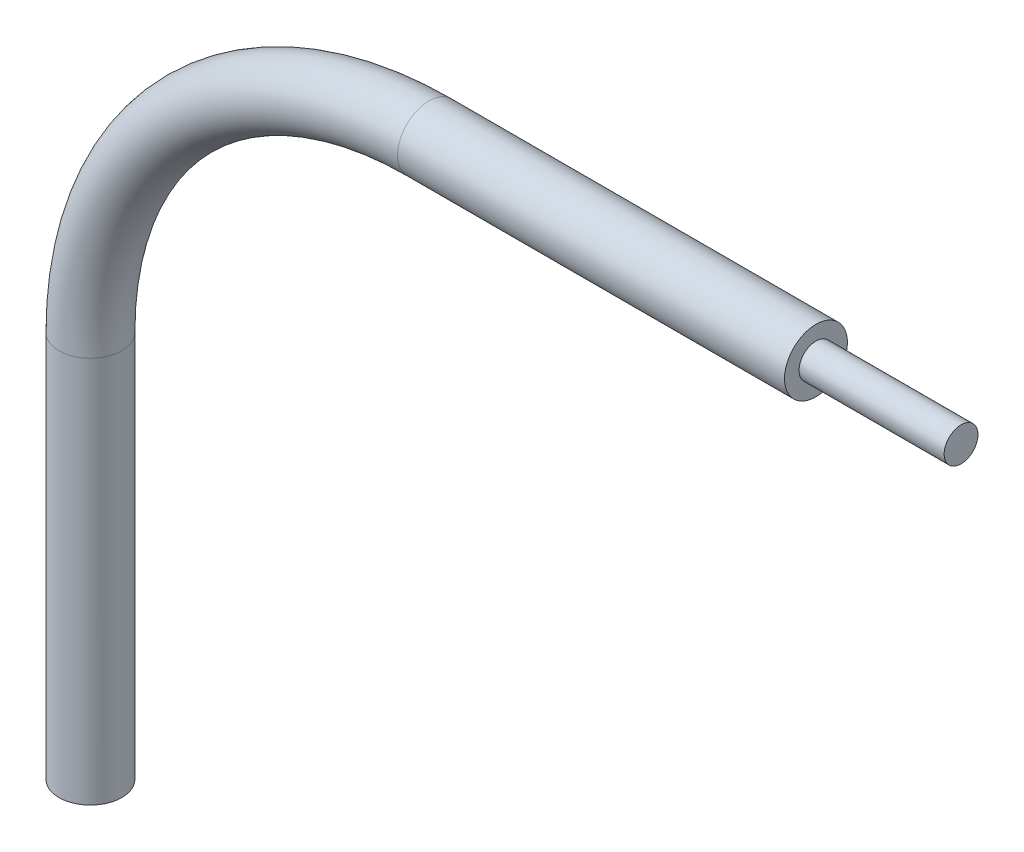
ISO-10303-21;
HEADER;
FILE_DESCRIPTION(('STEP AP214'),'2;1');
FILE_NAME('part.step','',(''),(''),'','','');
FILE_SCHEMA(('AUTOMOTIVE_DESIGN { 1 0 10303 214 1 1 1 1 }'));
ENDSEC;
DATA;
#1=APPLICATION_CONTEXT('core data for automotive mechanical design processes');
#2=APPLICATION_PROTOCOL_DEFINITION('international standard','automotive_design',2000,#1);
#3=PRODUCT_CONTEXT('',#1,'mechanical');
#4=PRODUCT('Part','Part','',(#3));
#5=PRODUCT_RELATED_PRODUCT_CATEGORY('part','',(#4));
#6=PRODUCT_DEFINITION_FORMATION('','',#4);
#7=PRODUCT_DEFINITION_CONTEXT('part definition',#1,'design');
#8=PRODUCT_DEFINITION('design','',#6,#7);
#9=PRODUCT_DEFINITION_SHAPE('','',#8);
#10=(LENGTH_UNIT() NAMED_UNIT(*) SI_UNIT(.MILLI.,.METRE.));
#11=(NAMED_UNIT(*) PLANE_ANGLE_UNIT() SI_UNIT($,.RADIAN.));
#12=(NAMED_UNIT(*) SI_UNIT($,.STERADIAN.) SOLID_ANGLE_UNIT());
#13=UNCERTAINTY_MEASURE_WITH_UNIT(LENGTH_MEASURE(1.E-05),#10,'distance_accuracy_value','');
#14=(GEOMETRIC_REPRESENTATION_CONTEXT(3) GLOBAL_UNCERTAINTY_ASSIGNED_CONTEXT((#13)) GLOBAL_UNIT_ASSIGNED_CONTEXT((#10,
#11,#12)) REPRESENTATION_CONTEXT('',''));
#15=CARTESIAN_POINT('',(0.,0.,0.));
#16=DIRECTION('',(0.,0.,1.));
#17=DIRECTION('',(1.,0.,0.));
#18=AXIS2_PLACEMENT_3D('',#15,#16,#17);
#19=CARTESIAN_POINT('',(0.,0.,0.));
#20=DIRECTION('',(0.,-1.,0.));
#21=DIRECTION('',(0.,0.,1.));
#22=AXIS2_PLACEMENT_3D('',#19,#20,#21);
#23=PLANE('',#22);
#24=CARTESIAN_POINT('',(0.,0.,0.));
#25=DIRECTION('',(0.,-1.,0.));
#26=DIRECTION('',(0.,0.,1.));
#27=AXIS2_PLACEMENT_3D('',#24,#25,#26);
#28=CIRCLE('',#27,0.65);
#29=CARTESIAN_POINT('',(0.,0.,0.65));
#30=VERTEX_POINT('',#29);
#31=EDGE_CURVE('E76',#30,#30,#28,.T.);
#32=ORIENTED_EDGE('',*,*,#31,.T.);
#33=EDGE_LOOP('',(#32));
#34=FACE_BOUND('',#33,.T.);
#35=ADVANCED_FACE('F59',(#34),#23,.T.);
#36=CARTESIAN_POINT('',(15.,15.,0.));
#37=DIRECTION('',(-1.,0.,0.));
#38=DIRECTION('',(0.,0.,1.));
#39=AXIS2_PLACEMENT_3D('',#36,#37,#38);
#40=PLANE('',#39);
#41=CARTESIAN_POINT('',(15.,15.,0.));
#42=DIRECTION('',(1.,0.,0.));
#43=DIRECTION('',(0.,0.,-1.));
#44=AXIS2_PLACEMENT_3D('',#41,#42,#43);
#45=CIRCLE('',#44,0.35);
#46=CARTESIAN_POINT('',(15.,15.,-0.35));
#47=VERTEX_POINT('',#46);
#48=EDGE_CURVE('E11',#47,#47,#45,.T.);
#49=ORIENTED_EDGE('',*,*,#48,.F.);
#50=EDGE_LOOP('',(#49));
#51=FACE_BOUND('',#50,.T.);
#52=CARTESIAN_POINT('',(15.,15.,0.));
#53=DIRECTION('',(-1.,0.,0.));
#54=DIRECTION('',(0.,0.,1.));
#55=AXIS2_PLACEMENT_3D('',#52,#53,#54);
#56=CIRCLE('',#55,0.65);
#57=CARTESIAN_POINT('',(15.,15.,0.65));
#58=VERTEX_POINT('',#57);
#59=EDGE_CURVE('E62',#58,#58,#56,.T.);
#60=ORIENTED_EDGE('',*,*,#59,.F.);
#61=EDGE_LOOP('',(#60));
#62=FACE_BOUND('',#61,.T.);
#63=ADVANCED_FACE('F105',(#51,#62),#40,.F.);
#64=CARTESIAN_POINT('',(0.,0.,0.));
#65=DIRECTION('',(0.,1.,0.));
#66=DIRECTION('',(0.,0.,1.));
#67=AXIS2_PLACEMENT_3D('',#64,#65,#66);
#68=CYLINDRICAL_SURFACE('',#67,0.65);
#69=CARTESIAN_POINT('',(0.,8.,0.));
#70=DIRECTION('',(0.,-1.,0.));
#71=DIRECTION('',(0.,0.,1.));
#72=AXIS2_PLACEMENT_3D('',#69,#70,#71);
#73=CIRCLE('',#72,0.65);
#74=CARTESIAN_POINT('',(-0.65,8.,0.));
#75=VERTEX_POINT('',#74);
#76=EDGE_CURVE('E80',#75,#75,#73,.T.);
#77=ORIENTED_EDGE('',*,*,#76,.T.);
#78=EDGE_LOOP('',(#77));
#79=FACE_BOUND('',#78,.T.);
#80=ORIENTED_EDGE('',*,*,#31,.F.);
#81=EDGE_LOOP('',(#80));
#82=FACE_BOUND('',#81,.T.);
#83=ADVANCED_FACE('F102',(#79,#82),#68,.T.);
#84=CARTESIAN_POINT('',(7.,8.,0.));
#85=DIRECTION('',(0.,0.,-1.));
#86=DIRECTION('',(-1.,0.,0.));
#87=AXIS2_PLACEMENT_3D('',#84,#85,#86);
#88=TOROIDAL_SURFACE('',#87,7.,0.65);
#89=CARTESIAN_POINT('',(7.00000000000001,15.,0.));
#90=DIRECTION('',(-1.,0.,0.));
#91=DIRECTION('',(0.,0.,1.));
#92=AXIS2_PLACEMENT_3D('',#89,#90,#91);
#93=CIRCLE('',#92,0.65);
#94=CARTESIAN_POINT('',(7.00000000000001,15.65,0.));
#95=VERTEX_POINT('',#94);
#96=EDGE_CURVE('E72',#95,#95,#93,.T.);
#97=CARTESIAN_POINT('',(7.,8.,0.));
#98=DIRECTION('',(0.,0.,-1.));
#99=DIRECTION('',(-1.,0.,0.));
#100=AXIS2_PLACEMENT_3D('',#97,#98,#99);
#101=CIRCLE('',#100,7.65);
#102=EDGE_CURVE('',#75,#95,#101,.T.);
#103=ORIENTED_EDGE('',*,*,#76,.F.);
#104=ORIENTED_EDGE('',*,*,#96,.T.);
#105=ORIENTED_EDGE('',*,*,#102,.T.);
#106=ORIENTED_EDGE('',*,*,#102,.F.);
#107=EDGE_LOOP('',(#103,#105,#104,#106));
#108=FACE_BOUND('',#107,.T.);
#109=ADVANCED_FACE('F87',(#108),#88,.T.);
#110=CARTESIAN_POINT('',(7.,15.,0.));
#111=DIRECTION('',(1.,0.,0.));
#112=DIRECTION('',(0.,1.,0.));
#113=AXIS2_PLACEMENT_3D('',#110,#111,#112);
#114=CYLINDRICAL_SURFACE('',#113,0.65);
#115=ORIENTED_EDGE('',*,*,#59,.T.);
#116=EDGE_LOOP('',(#115));
#117=FACE_BOUND('',#116,.T.);
#118=ORIENTED_EDGE('',*,*,#96,.F.);
#119=EDGE_LOOP('',(#118));
#120=FACE_BOUND('',#119,.T.);
#121=ADVANCED_FACE('F90',(#117,#120),#114,.T.);
#122=CARTESIAN_POINT('',(18.,15.,0.));
#123=DIRECTION('',(-1.,0.,0.));
#124=DIRECTION('',(0.,0.,1.));
#125=AXIS2_PLACEMENT_3D('',#122,#123,#124);
#126=CYLINDRICAL_SURFACE('',#125,0.35);
#127=CARTESIAN_POINT('',(18.,15.,0.));
#128=DIRECTION('',(1.,0.,0.));
#129=DIRECTION('',(0.,0.,-1.));
#130=AXIS2_PLACEMENT_3D('',#127,#128,#129);
#131=CIRCLE('',#130,0.35);
#132=CARTESIAN_POINT('',(18.,15.,-0.35));
#133=VERTEX_POINT('',#132);
#134=EDGE_CURVE('E75',#133,#133,#131,.T.);
#135=ORIENTED_EDGE('',*,*,#134,.F.);
#136=EDGE_LOOP('',(#135));
#137=FACE_BOUND('',#136,.T.);
#138=ORIENTED_EDGE('',*,*,#48,.T.);
#139=EDGE_LOOP('',(#138));
#140=FACE_BOUND('',#139,.T.);
#141=ADVANCED_FACE('F92',(#137,#140),#126,.T.);
#142=CARTESIAN_POINT('',(18.,15.,0.));
#143=DIRECTION('',(1.,0.,0.));
#144=DIRECTION('',(0.,0.,-1.));
#145=AXIS2_PLACEMENT_3D('',#142,#143,#144);
#146=PLANE('',#145);
#147=ORIENTED_EDGE('',*,*,#134,.T.);
#148=EDGE_LOOP('',(#147));
#149=FACE_BOUND('',#148,.T.);
#150=ADVANCED_FACE('F99',(#149),#146,.T.);
#151=CLOSED_SHELL('',(#35,#63,#83,#109,#121,#141,#150));
#152=MANIFOLD_SOLID_BREP('B2',#151);
#153=ADVANCED_BREP_SHAPE_REPRESENTATION('',(#18,#152),#14);
#154=SHAPE_DEFINITION_REPRESENTATION(#9,#153);
ENDSEC;
END-ISO-10303-21;
